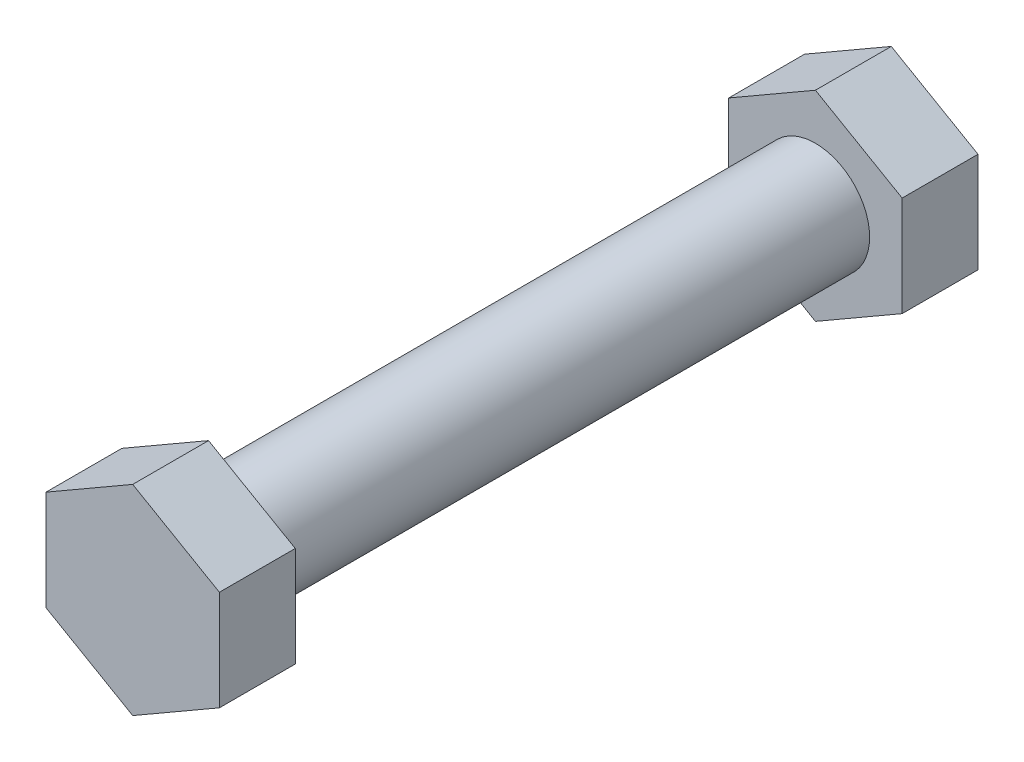
ISO-10303-21;
HEADER;
FILE_DESCRIPTION(('STEP AP214'),'2;1');
FILE_NAME('part.step','',(''),(''),'','','');
FILE_SCHEMA(('AUTOMOTIVE_DESIGN { 1 0 10303 214 1 1 1 1 }'));
ENDSEC;
DATA;
#1=APPLICATION_CONTEXT('core data for automotive mechanical design processes');
#2=APPLICATION_PROTOCOL_DEFINITION('international standard','automotive_design',2000,#1);
#3=PRODUCT_CONTEXT('',#1,'mechanical');
#4=PRODUCT('Part','Part','',(#3));
#5=PRODUCT_RELATED_PRODUCT_CATEGORY('part','',(#4));
#6=PRODUCT_DEFINITION_FORMATION('','',#4);
#7=PRODUCT_DEFINITION_CONTEXT('part definition',#1,'design');
#8=PRODUCT_DEFINITION('design','',#6,#7);
#9=PRODUCT_DEFINITION_SHAPE('','',#8);
#10=(LENGTH_UNIT() NAMED_UNIT(*) SI_UNIT(.MILLI.,.METRE.));
#11=(NAMED_UNIT(*) PLANE_ANGLE_UNIT() SI_UNIT($,.RADIAN.));
#12=(NAMED_UNIT(*) SI_UNIT($,.STERADIAN.) SOLID_ANGLE_UNIT());
#13=UNCERTAINTY_MEASURE_WITH_UNIT(LENGTH_MEASURE(1.E-05),#10,'distance_accuracy_value','');
#14=(GEOMETRIC_REPRESENTATION_CONTEXT(3) GLOBAL_UNCERTAINTY_ASSIGNED_CONTEXT((#13)) GLOBAL_UNIT_ASSIGNED_CONTEXT((#10,
#11,#12)) REPRESENTATION_CONTEXT('',''));
#15=CARTESIAN_POINT('',(0.,0.,0.));
#16=DIRECTION('',(0.,0.,1.));
#17=DIRECTION('',(1.,0.,0.));
#18=AXIS2_PLACEMENT_3D('',#15,#16,#17);
#19=CARTESIAN_POINT('',(8.,-4.618802153517,-28.));
#20=DIRECTION('',(-1.,0.,0.));
#21=DIRECTION('',(0.,0.,1.));
#22=AXIS2_PLACEMENT_3D('',#19,#20,#21);
#23=PLANE('',#22);
#24=DIRECTION('',(0.,1.,0.));
#25=VECTOR('',#24,1.);
#26=CARTESIAN_POINT('',(8.,-4.618802153517,-35.));
#27=LINE('',#26,#25);
#28=CARTESIAN_POINT('',(8.,-4.618802153517,-35.));
#29=VERTEX_POINT('',#28);
#30=CARTESIAN_POINT('',(8.,4.61880215351701,-35.));
#31=VERTEX_POINT('',#30);
#32=EDGE_CURVE('E128',#29,#31,#27,.T.);
#33=ORIENTED_EDGE('',*,*,#32,.T.);
#34=DIRECTION('',(0.,0.,-1.));
#35=VECTOR('',#34,1.);
#36=CARTESIAN_POINT('',(8.,4.61880215351701,-28.));
#37=LINE('',#36,#35);
#38=CARTESIAN_POINT('',(8.,4.61880215351701,-28.));
#39=VERTEX_POINT('',#38);
#40=EDGE_CURVE('E11',#39,#31,#37,.T.);
#41=ORIENTED_EDGE('',*,*,#40,.F.);
#42=DIRECTION('',(0.,1.,0.));
#43=VECTOR('',#42,1.);
#44=CARTESIAN_POINT('',(8.,-4.618802153517,-28.));
#45=LINE('',#44,#43);
#46=CARTESIAN_POINT('',(8.,-4.618802153517,-28.));
#47=VERTEX_POINT('',#46);
#48=EDGE_CURVE('E136',#47,#39,#45,.T.);
#49=ORIENTED_EDGE('',*,*,#48,.F.);
#50=DIRECTION('',(0.,0.,-1.));
#51=VECTOR('',#50,1.);
#52=CARTESIAN_POINT('',(8.,-4.618802153517,-28.));
#53=LINE('',#52,#51);
#54=EDGE_CURVE('E127',#47,#29,#53,.T.);
#55=ORIENTED_EDGE('',*,*,#54,.T.);
#56=EDGE_LOOP('',(#33,#41,#49,#55));
#57=FACE_BOUND('',#56,.T.);
#58=ADVANCED_FACE('F41',(#57),#23,.F.);
#59=CARTESIAN_POINT('',(8.,4.61880215351701,-28.));
#60=DIRECTION('',(-0.5,-0.866025403784439,0.));
#61=DIRECTION('',(0.866025403784439,-0.5,0.));
#62=AXIS2_PLACEMENT_3D('',#59,#60,#61);
#63=PLANE('',#62);
#64=DIRECTION('',(-0.866025403784439,0.5,0.));
#65=VECTOR('',#64,1.);
#66=CARTESIAN_POINT('',(8.,4.61880215351701,-35.));
#67=LINE('',#66,#65);
#68=CARTESIAN_POINT('',(0.,9.23760430703402,-35.));
#69=VERTEX_POINT('',#68);
#70=EDGE_CURVE('E134',#31,#69,#67,.T.);
#71=ORIENTED_EDGE('',*,*,#70,.T.);
#72=DIRECTION('',(0.,0.,-1.));
#73=VECTOR('',#72,1.);
#74=CARTESIAN_POINT('',(0.,9.23760430703402,-28.));
#75=LINE('',#74,#73);
#76=CARTESIAN_POINT('',(0.,9.23760430703402,-28.));
#77=VERTEX_POINT('',#76);
#78=EDGE_CURVE('E49',#77,#69,#75,.T.);
#79=ORIENTED_EDGE('',*,*,#78,.F.);
#80=DIRECTION('',(-0.866025403784439,0.5,0.));
#81=VECTOR('',#80,1.);
#82=CARTESIAN_POINT('',(8.,4.61880215351701,-28.));
#83=LINE('',#82,#81);
#84=EDGE_CURVE('E96',#39,#77,#83,.T.);
#85=ORIENTED_EDGE('',*,*,#84,.F.);
#86=ORIENTED_EDGE('',*,*,#40,.T.);
#87=EDGE_LOOP('',(#71,#79,#85,#86));
#88=FACE_BOUND('',#87,.T.);
#89=ADVANCED_FACE('F170',(#88),#63,.F.);
#90=CARTESIAN_POINT('',(0.,9.23760430703402,-28.));
#91=DIRECTION('',(0.5,-0.866025403784439,0.));
#92=DIRECTION('',(0.866025403784439,0.5,0.));
#93=AXIS2_PLACEMENT_3D('',#90,#91,#92);
#94=PLANE('',#93);
#95=DIRECTION('',(-0.866025403784439,-0.5,0.));
#96=VECTOR('',#95,1.);
#97=CARTESIAN_POINT('',(0.,9.23760430703402,-35.));
#98=LINE('',#97,#96);
#99=CARTESIAN_POINT('',(-8.,4.61880215351701,-35.));
#100=VERTEX_POINT('',#99);
#101=EDGE_CURVE('E133',#69,#100,#98,.T.);
#102=ORIENTED_EDGE('',*,*,#101,.T.);
#103=DIRECTION('',(0.,0.,-1.));
#104=VECTOR('',#103,1.);
#105=CARTESIAN_POINT('',(-8.,4.61880215351701,-28.));
#106=LINE('',#105,#104);
#107=CARTESIAN_POINT('',(-8.,4.61880215351701,-28.));
#108=VERTEX_POINT('',#107);
#109=EDGE_CURVE('E122',#108,#100,#106,.T.);
#110=ORIENTED_EDGE('',*,*,#109,.F.);
#111=DIRECTION('',(-0.866025403784439,-0.5,0.));
#112=VECTOR('',#111,1.);
#113=CARTESIAN_POINT('',(0.,9.23760430703402,-28.));
#114=LINE('',#113,#112);
#115=EDGE_CURVE('E115',#77,#108,#114,.T.);
#116=ORIENTED_EDGE('',*,*,#115,.F.);
#117=ORIENTED_EDGE('',*,*,#78,.T.);
#118=EDGE_LOOP('',(#102,#110,#116,#117));
#119=FACE_BOUND('',#118,.T.);
#120=ADVANCED_FACE('F150',(#119),#94,.F.);
#121=CARTESIAN_POINT('',(-8.,4.61880215351701,-28.));
#122=DIRECTION('',(1.,0.,0.));
#123=DIRECTION('',(0.,1.,0.));
#124=AXIS2_PLACEMENT_3D('',#121,#122,#123);
#125=PLANE('',#124);
#126=DIRECTION('',(0.,-1.,0.));
#127=VECTOR('',#126,1.);
#128=CARTESIAN_POINT('',(-8.,4.61880215351701,-35.));
#129=LINE('',#128,#127);
#130=CARTESIAN_POINT('',(-8.,-4.618802153517,-35.));
#131=VERTEX_POINT('',#130);
#132=EDGE_CURVE('E118',#100,#131,#129,.T.);
#133=ORIENTED_EDGE('',*,*,#132,.T.);
#134=DIRECTION('',(0.,0.,-1.));
#135=VECTOR('',#134,1.);
#136=CARTESIAN_POINT('',(-8.,-4.618802153517,-28.));
#137=LINE('',#136,#135);
#138=CARTESIAN_POINT('',(-8.,-4.618802153517,-28.));
#139=VERTEX_POINT('',#138);
#140=EDGE_CURVE('E120',#139,#131,#137,.T.);
#141=ORIENTED_EDGE('',*,*,#140,.F.);
#142=DIRECTION('',(0.,-1.,0.));
#143=VECTOR('',#142,1.);
#144=CARTESIAN_POINT('',(-8.,4.61880215351701,-28.));
#145=LINE('',#144,#143);
#146=EDGE_CURVE('E106',#108,#139,#145,.T.);
#147=ORIENTED_EDGE('',*,*,#146,.F.);
#148=ORIENTED_EDGE('',*,*,#109,.T.);
#149=EDGE_LOOP('',(#133,#141,#147,#148));
#150=FACE_BOUND('',#149,.T.);
#151=ADVANCED_FACE('F119',(#150),#125,.F.);
#152=CARTESIAN_POINT('',(-8.,-4.618802153517,-28.));
#153=DIRECTION('',(0.5,0.866025403784438,0.));
#154=DIRECTION('',(-0.866025403784438,0.5,0.));
#155=AXIS2_PLACEMENT_3D('',#152,#153,#154);
#156=PLANE('',#155);
#157=DIRECTION('',(0.866025403784438,-0.5,0.));
#158=VECTOR('',#157,1.);
#159=CARTESIAN_POINT('',(-8.,-4.618802153517,-35.));
#160=LINE('',#159,#158);
#161=CARTESIAN_POINT('',(0.,-9.23760430703402,-35.));
#162=VERTEX_POINT('',#161);
#163=EDGE_CURVE('E85',#131,#162,#160,.T.);
#164=ORIENTED_EDGE('',*,*,#163,.T.);
#165=DIRECTION('',(0.,0.,-1.));
#166=VECTOR('',#165,1.);
#167=CARTESIAN_POINT('',(0.,-9.23760430703402,-28.));
#168=LINE('',#167,#166);
#169=CARTESIAN_POINT('',(0.,-9.23760430703402,-28.));
#170=VERTEX_POINT('',#169);
#171=EDGE_CURVE('E125',#170,#162,#168,.T.);
#172=ORIENTED_EDGE('',*,*,#171,.F.);
#173=DIRECTION('',(0.866025403784438,-0.5,0.));
#174=VECTOR('',#173,1.);
#175=CARTESIAN_POINT('',(-8.,-4.618802153517,-28.));
#176=LINE('',#175,#174);
#177=EDGE_CURVE('E109',#139,#170,#176,.T.);
#178=ORIENTED_EDGE('',*,*,#177,.F.);
#179=ORIENTED_EDGE('',*,*,#140,.T.);
#180=EDGE_LOOP('',(#164,#172,#178,#179));
#181=FACE_BOUND('',#180,.T.);
#182=ADVANCED_FACE('F124',(#181),#156,.F.);
#183=CARTESIAN_POINT('',(0.,-9.23760430703402,-28.));
#184=DIRECTION('',(-0.5,0.866025403784438,0.));
#185=DIRECTION('',(-0.866025403784439,-0.5,0.));
#186=AXIS2_PLACEMENT_3D('',#183,#184,#185);
#187=PLANE('',#186);
#188=DIRECTION('',(0.866025403784438,0.5,0.));
#189=VECTOR('',#188,1.);
#190=CARTESIAN_POINT('',(0.,-9.23760430703402,-35.));
#191=LINE('',#190,#189);
#192=EDGE_CURVE('E86',#162,#29,#191,.T.);
#193=ORIENTED_EDGE('',*,*,#192,.T.);
#194=ORIENTED_EDGE('',*,*,#54,.F.);
#195=DIRECTION('',(0.866025403784438,0.5,0.));
#196=VECTOR('',#195,1.);
#197=CARTESIAN_POINT('',(0.,-9.23760430703402,-28.));
#198=LINE('',#197,#196);
#199=EDGE_CURVE('E59',#170,#47,#198,.T.);
#200=ORIENTED_EDGE('',*,*,#199,.F.);
#201=ORIENTED_EDGE('',*,*,#171,.T.);
#202=EDGE_LOOP('',(#193,#194,#200,#201));
#203=FACE_BOUND('',#202,.T.);
#204=ADVANCED_FACE('F152',(#203),#187,.F.);
#205=CARTESIAN_POINT('',(0.,0.,-28.));
#206=DIRECTION('',(0.,0.,1.));
#207=DIRECTION('',(1.,0.,0.));
#208=AXIS2_PLACEMENT_3D('',#205,#206,#207);
#209=PLANE('',#208);
#210=CARTESIAN_POINT('',(0.,0.,-28.));
#211=DIRECTION('',(0.,0.,1.));
#212=DIRECTION('',(1.,0.,0.));
#213=AXIS2_PLACEMENT_3D('',#210,#211,#212);
#214=CIRCLE('',#213,5.);
#215=CARTESIAN_POINT('',(5.,0.,-28.));
#216=VERTEX_POINT('',#215);
#217=EDGE_CURVE('E42',#216,#216,#214,.F.);
#218=ORIENTED_EDGE('',*,*,#217,.T.);
#219=EDGE_LOOP('',(#218));
#220=FACE_BOUND('',#219,.T.);
#221=ORIENTED_EDGE('',*,*,#48,.T.);
#222=ORIENTED_EDGE('',*,*,#84,.T.);
#223=ORIENTED_EDGE('',*,*,#115,.T.);
#224=ORIENTED_EDGE('',*,*,#146,.T.);
#225=ORIENTED_EDGE('',*,*,#177,.T.);
#226=ORIENTED_EDGE('',*,*,#199,.T.);
#227=EDGE_LOOP('',(#221,#222,#223,#224,#225,#226));
#228=FACE_BOUND('',#227,.T.);
#229=ADVANCED_FACE('F107',(#220,#228),#209,.T.);
#230=CARTESIAN_POINT('',(0.,0.,-35.));
#231=DIRECTION('',(0.,0.,1.));
#232=DIRECTION('',(1.,0.,0.));
#233=AXIS2_PLACEMENT_3D('',#230,#231,#232);
#234=PLANE('',#233);
#235=ORIENTED_EDGE('',*,*,#32,.F.);
#236=ORIENTED_EDGE('',*,*,#192,.F.);
#237=ORIENTED_EDGE('',*,*,#163,.F.);
#238=ORIENTED_EDGE('',*,*,#132,.F.);
#239=ORIENTED_EDGE('',*,*,#101,.F.);
#240=ORIENTED_EDGE('',*,*,#70,.F.);
#241=EDGE_LOOP('',(#235,#236,#237,#238,#239,#240));
#242=FACE_BOUND('',#241,.T.);
#243=ADVANCED_FACE('F147',(#242),#234,.F.);
#244=CARTESIAN_POINT('',(8.,-4.618802153517,35.));
#245=DIRECTION('',(-1.,0.,0.));
#246=DIRECTION('',(0.,0.,1.));
#247=AXIS2_PLACEMENT_3D('',#244,#245,#246);
#248=PLANE('',#247);
#249=DIRECTION('',(0.,1.,0.));
#250=VECTOR('',#249,1.);
#251=CARTESIAN_POINT('',(8.,-4.618802153517,28.));
#252=LINE('',#251,#250);
#253=CARTESIAN_POINT('',(8.,-4.618802153517,28.));
#254=VERTEX_POINT('',#253);
#255=CARTESIAN_POINT('',(8.,4.61880215351701,28.));
#256=VERTEX_POINT('',#255);
#257=EDGE_CURVE('E365',#254,#256,#252,.T.);
#258=ORIENTED_EDGE('',*,*,#257,.T.);
#259=DIRECTION('',(0.,0.,-1.));
#260=VECTOR('',#259,1.);
#261=CARTESIAN_POINT('',(8.,4.61880215351701,35.));
#262=LINE('',#261,#260);
#263=CARTESIAN_POINT('',(8.,4.61880215351701,35.));
#264=VERTEX_POINT('',#263);
#265=EDGE_CURVE('E324',#264,#256,#262,.T.);
#266=ORIENTED_EDGE('',*,*,#265,.F.);
#267=DIRECTION('',(0.,1.,0.));
#268=VECTOR('',#267,1.);
#269=CARTESIAN_POINT('',(8.,-4.618802153517,35.));
#270=LINE('',#269,#268);
#271=CARTESIAN_POINT('',(8.,-4.618802153517,35.));
#272=VERTEX_POINT('',#271);
#273=EDGE_CURVE('E352',#272,#264,#270,.T.);
#274=ORIENTED_EDGE('',*,*,#273,.F.);
#275=DIRECTION('',(0.,0.,-1.));
#276=VECTOR('',#275,1.);
#277=CARTESIAN_POINT('',(8.,-4.618802153517,35.));
#278=LINE('',#277,#276);
#279=EDGE_CURVE('E344',#272,#254,#278,.T.);
#280=ORIENTED_EDGE('',*,*,#279,.T.);
#281=EDGE_LOOP('',(#258,#266,#274,#280));
#282=FACE_BOUND('',#281,.T.);
#283=ADVANCED_FACE('F189',(#282),#248,.F.);
#284=CARTESIAN_POINT('',(8.,4.61880215351701,35.));
#285=DIRECTION('',(-0.5,-0.866025403784439,0.));
#286=DIRECTION('',(0.866025403784439,-0.5,0.));
#287=AXIS2_PLACEMENT_3D('',#284,#285,#286);
#288=PLANE('',#287);
#289=DIRECTION('',(-0.866025403784439,0.5,0.));
#290=VECTOR('',#289,1.);
#291=CARTESIAN_POINT('',(8.,4.61880215351701,28.));
#292=LINE('',#291,#290);
#293=CARTESIAN_POINT('',(0.,9.23760430703402,28.));
#294=VERTEX_POINT('',#293);
#295=EDGE_CURVE('E363',#256,#294,#292,.T.);
#296=ORIENTED_EDGE('',*,*,#295,.T.);
#297=DIRECTION('',(0.,0.,-1.));
#298=VECTOR('',#297,1.);
#299=CARTESIAN_POINT('',(0.,9.23760430703402,35.));
#300=LINE('',#299,#298);
#301=CARTESIAN_POINT('',(0.,9.23760430703402,35.));
#302=VERTEX_POINT('',#301);
#303=EDGE_CURVE('E327',#302,#294,#300,.T.);
#304=ORIENTED_EDGE('',*,*,#303,.F.);
#305=DIRECTION('',(-0.866025403784439,0.5,0.));
#306=VECTOR('',#305,1.);
#307=CARTESIAN_POINT('',(8.,4.61880215351701,35.));
#308=LINE('',#307,#306);
#309=EDGE_CURVE('E378',#264,#302,#308,.T.);
#310=ORIENTED_EDGE('',*,*,#309,.F.);
#311=ORIENTED_EDGE('',*,*,#265,.T.);
#312=EDGE_LOOP('',(#296,#304,#310,#311));
#313=FACE_BOUND('',#312,.T.);
#314=ADVANCED_FACE('F197',(#313),#288,.F.);
#315=CARTESIAN_POINT('',(0.,9.23760430703402,35.));
#316=DIRECTION('',(0.5,-0.866025403784439,0.));
#317=DIRECTION('',(0.866025403784439,0.5,0.));
#318=AXIS2_PLACEMENT_3D('',#315,#316,#317);
#319=PLANE('',#318);
#320=DIRECTION('',(-0.866025403784439,-0.5,0.));
#321=VECTOR('',#320,1.);
#322=CARTESIAN_POINT('',(0.,9.23760430703402,28.));
#323=LINE('',#322,#321);
#324=CARTESIAN_POINT('',(-8.,4.61880215351701,28.));
#325=VERTEX_POINT('',#324);
#326=EDGE_CURVE('E358',#294,#325,#323,.T.);
#327=ORIENTED_EDGE('',*,*,#326,.T.);
#328=DIRECTION('',(0.,0.,-1.));
#329=VECTOR('',#328,1.);
#330=CARTESIAN_POINT('',(-8.,4.61880215351701,35.));
#331=LINE('',#330,#329);
#332=CARTESIAN_POINT('',(-8.,4.61880215351701,35.));
#333=VERTEX_POINT('',#332);
#334=EDGE_CURVE('E333',#333,#325,#331,.T.);
#335=ORIENTED_EDGE('',*,*,#334,.F.);
#336=DIRECTION('',(-0.866025403784439,-0.5,0.));
#337=VECTOR('',#336,1.);
#338=CARTESIAN_POINT('',(0.,9.23760430703402,35.));
#339=LINE('',#338,#337);
#340=EDGE_CURVE('E374',#302,#333,#339,.T.);
#341=ORIENTED_EDGE('',*,*,#340,.F.);
#342=ORIENTED_EDGE('',*,*,#303,.T.);
#343=EDGE_LOOP('',(#327,#335,#341,#342));
#344=FACE_BOUND('',#343,.T.);
#345=ADVANCED_FACE('F207',(#344),#319,.F.);
#346=CARTESIAN_POINT('',(-8.,4.61880215351701,35.));
#347=DIRECTION('',(1.,0.,0.));
#348=DIRECTION('',(0.,1.,0.));
#349=AXIS2_PLACEMENT_3D('',#346,#347,#348);
#350=PLANE('',#349);
#351=DIRECTION('',(0.,-1.,0.));
#352=VECTOR('',#351,1.);
#353=CARTESIAN_POINT('',(-8.,4.61880215351701,28.));
#354=LINE('',#353,#352);
#355=CARTESIAN_POINT('',(-8.,-4.618802153517,28.));
#356=VERTEX_POINT('',#355);
#357=EDGE_CURVE('E353',#325,#356,#354,.T.);
#358=ORIENTED_EDGE('',*,*,#357,.T.);
#359=DIRECTION('',(0.,0.,-1.));
#360=VECTOR('',#359,1.);
#361=CARTESIAN_POINT('',(-8.,-4.618802153517,35.));
#362=LINE('',#361,#360);
#363=CARTESIAN_POINT('',(-8.,-4.618802153517,35.));
#364=VERTEX_POINT('',#363);
#365=EDGE_CURVE('E339',#364,#356,#362,.T.);
#366=ORIENTED_EDGE('',*,*,#365,.F.);
#367=DIRECTION('',(0.,-1.,0.));
#368=VECTOR('',#367,1.);
#369=CARTESIAN_POINT('',(-8.,4.61880215351701,35.));
#370=LINE('',#369,#368);
#371=EDGE_CURVE('E375',#333,#364,#370,.T.);
#372=ORIENTED_EDGE('',*,*,#371,.F.);
#373=ORIENTED_EDGE('',*,*,#334,.T.);
#374=EDGE_LOOP('',(#358,#366,#372,#373));
#375=FACE_BOUND('',#374,.T.);
#376=ADVANCED_FACE('F219',(#375),#350,.F.);
#377=CARTESIAN_POINT('',(-8.,-4.618802153517,35.));
#378=DIRECTION('',(0.5,0.866025403784438,0.));
#379=DIRECTION('',(-0.866025403784438,0.5,0.));
#380=AXIS2_PLACEMENT_3D('',#377,#378,#379);
#381=PLANE('',#380);
#382=DIRECTION('',(0.866025403784438,-0.5,0.));
#383=VECTOR('',#382,1.);
#384=CARTESIAN_POINT('',(-8.,-4.618802153517,28.));
#385=LINE('',#384,#383);
#386=CARTESIAN_POINT('',(0.,-9.23760430703402,28.));
#387=VERTEX_POINT('',#386);
#388=EDGE_CURVE('E355',#356,#387,#385,.T.);
#389=ORIENTED_EDGE('',*,*,#388,.T.);
#390=DIRECTION('',(0.,0.,-1.));
#391=VECTOR('',#390,1.);
#392=CARTESIAN_POINT('',(0.,-9.23760430703402,35.));
#393=LINE('',#392,#391);
#394=CARTESIAN_POINT('',(0.,-9.23760430703402,35.));
#395=VERTEX_POINT('',#394);
#396=EDGE_CURVE('E342',#395,#387,#393,.T.);
#397=ORIENTED_EDGE('',*,*,#396,.F.);
#398=DIRECTION('',(0.866025403784438,-0.5,0.));
#399=VECTOR('',#398,1.);
#400=CARTESIAN_POINT('',(-8.,-4.618802153517,35.));
#401=LINE('',#400,#399);
#402=EDGE_CURVE('E369',#364,#395,#401,.T.);
#403=ORIENTED_EDGE('',*,*,#402,.F.);
#404=ORIENTED_EDGE('',*,*,#365,.T.);
#405=EDGE_LOOP('',(#389,#397,#403,#404));
#406=FACE_BOUND('',#405,.T.);
#407=ADVANCED_FACE('F232',(#406),#381,.F.);
#408=CARTESIAN_POINT('',(0.,-9.23760430703402,35.));
#409=DIRECTION('',(-0.5,0.866025403784438,0.));
#410=DIRECTION('',(-0.866025403784439,-0.5,0.));
#411=AXIS2_PLACEMENT_3D('',#408,#409,#410);
#412=PLANE('',#411);
#413=DIRECTION('',(0.866025403784438,0.5,0.));
#414=VECTOR('',#413,1.);
#415=CARTESIAN_POINT('',(0.,-9.23760430703402,28.));
#416=LINE('',#415,#414);
#417=EDGE_CURVE('E346',#387,#254,#416,.T.);
#418=ORIENTED_EDGE('',*,*,#417,.T.);
#419=ORIENTED_EDGE('',*,*,#279,.F.);
#420=DIRECTION('',(0.866025403784438,0.5,0.));
#421=VECTOR('',#420,1.);
#422=CARTESIAN_POINT('',(0.,-9.23760430703402,35.));
#423=LINE('',#422,#421);
#424=EDGE_CURVE('E350',#395,#272,#423,.T.);
#425=ORIENTED_EDGE('',*,*,#424,.F.);
#426=ORIENTED_EDGE('',*,*,#396,.T.);
#427=EDGE_LOOP('',(#418,#419,#425,#426));
#428=FACE_BOUND('',#427,.T.);
#429=ADVANCED_FACE('F245',(#428),#412,.F.);
#430=CARTESIAN_POINT('',(0.,0.,35.));
#431=DIRECTION('',(0.,0.,1.));
#432=DIRECTION('',(1.,0.,0.));
#433=AXIS2_PLACEMENT_3D('',#430,#431,#432);
#434=PLANE('',#433);
#435=ORIENTED_EDGE('',*,*,#273,.T.);
#436=ORIENTED_EDGE('',*,*,#309,.T.);
#437=ORIENTED_EDGE('',*,*,#340,.T.);
#438=ORIENTED_EDGE('',*,*,#371,.T.);
#439=ORIENTED_EDGE('',*,*,#402,.T.);
#440=ORIENTED_EDGE('',*,*,#424,.T.);
#441=EDGE_LOOP('',(#435,#436,#437,#438,#439,#440));
#442=FACE_BOUND('',#441,.T.);
#443=ADVANCED_FACE('F251',(#442),#434,.T.);
#444=CARTESIAN_POINT('',(0.,0.,28.));
#445=DIRECTION('',(0.,0.,1.));
#446=DIRECTION('',(1.,0.,0.));
#447=AXIS2_PLACEMENT_3D('',#444,#445,#446);
#448=PLANE('',#447);
#449=CARTESIAN_POINT('',(0.,0.,28.));
#450=DIRECTION('',(0.,0.,1.));
#451=DIRECTION('',(1.,0.,0.));
#452=AXIS2_PLACEMENT_3D('',#449,#450,#451);
#453=CIRCLE('',#452,5.);
#454=CARTESIAN_POINT('',(5.,0.,28.));
#455=VERTEX_POINT('',#454);
#456=EDGE_CURVE('E322',#455,#455,#453,.F.);
#457=ORIENTED_EDGE('',*,*,#456,.F.);
#458=EDGE_LOOP('',(#457));
#459=FACE_BOUND('',#458,.T.);
#460=ORIENTED_EDGE('',*,*,#257,.F.);
#461=ORIENTED_EDGE('',*,*,#417,.F.);
#462=ORIENTED_EDGE('',*,*,#388,.F.);
#463=ORIENTED_EDGE('',*,*,#357,.F.);
#464=ORIENTED_EDGE('',*,*,#326,.F.);
#465=ORIENTED_EDGE('',*,*,#295,.F.);
#466=EDGE_LOOP('',(#460,#461,#462,#463,#464,#465));
#467=FACE_BOUND('',#466,.T.);
#468=ADVANCED_FACE('F262',(#459,#467),#448,.F.);
#469=CARTESIAN_POINT('',(0.,0.,33.));
#470=DIRECTION('',(0.,0.,-1.));
#471=DIRECTION('',(-1.,0.,0.));
#472=AXIS2_PLACEMENT_3D('',#469,#470,#471);
#473=CYLINDRICAL_SURFACE('',#472,5.);
#474=ORIENTED_EDGE('',*,*,#217,.F.);
#475=EDGE_LOOP('',(#474));
#476=FACE_BOUND('',#475,.T.);
#477=ORIENTED_EDGE('',*,*,#456,.T.);
#478=EDGE_LOOP('',(#477));
#479=FACE_BOUND('',#478,.T.);
#480=ADVANCED_FACE('F274',(#476,#479),#473,.T.);
#481=CLOSED_SHELL('',(#58,#89,#120,#151,#182,#204,#229,#243,#283,#314,#345,#376,#407,#429,#443,
#468,#480));
#482=MANIFOLD_SOLID_BREP('B2',#481);
#483=ADVANCED_BREP_SHAPE_REPRESENTATION('',(#18,#482),#14);
#484=SHAPE_DEFINITION_REPRESENTATION(#9,#483);
ENDSEC;
END-ISO-10303-21;
